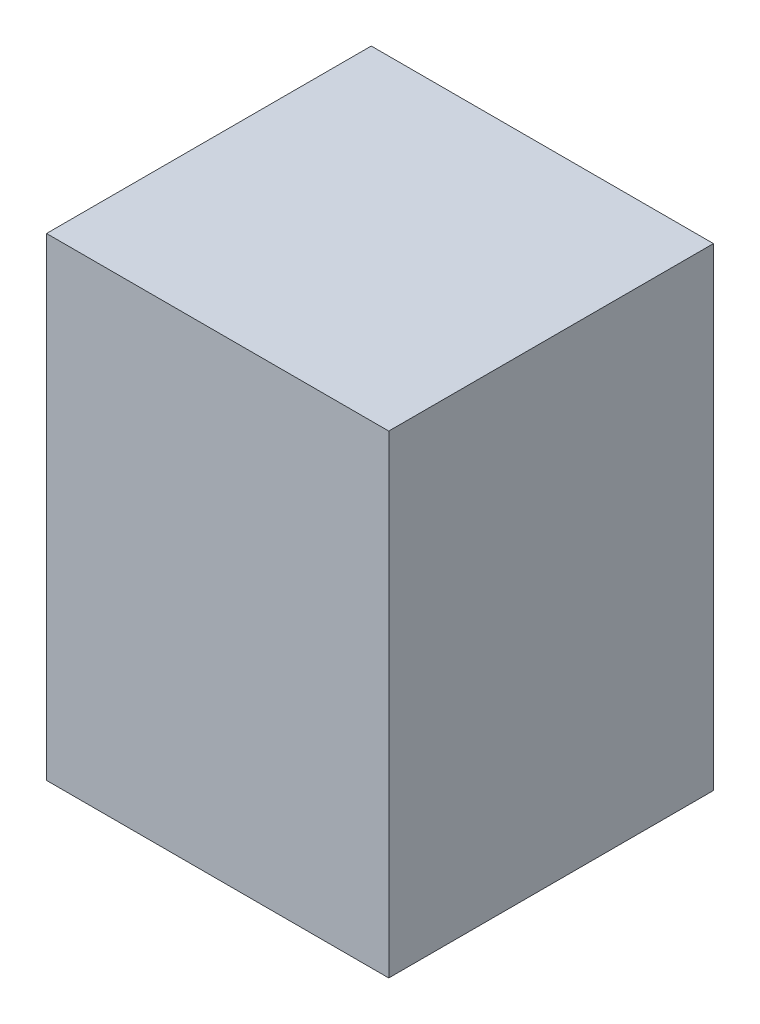
ISO-10303-21;
HEADER;
FILE_DESCRIPTION(('STEP AP214'),'2;1');
FILE_NAME('part.step','',(''),(''),'','','');
FILE_SCHEMA(('AUTOMOTIVE_DESIGN { 1 0 10303 214 1 1 1 1 }'));
ENDSEC;
DATA;
#1=APPLICATION_CONTEXT('core data for automotive mechanical design processes');
#2=APPLICATION_PROTOCOL_DEFINITION('international standard','automotive_design',2000,#1);
#3=PRODUCT_CONTEXT('',#1,'mechanical');
#4=PRODUCT('Part','Part','',(#3));
#5=PRODUCT_RELATED_PRODUCT_CATEGORY('part','',(#4));
#6=PRODUCT_DEFINITION_FORMATION('','',#4);
#7=PRODUCT_DEFINITION_CONTEXT('part definition',#1,'design');
#8=PRODUCT_DEFINITION('design','',#6,#7);
#9=PRODUCT_DEFINITION_SHAPE('','',#8);
#10=(LENGTH_UNIT() NAMED_UNIT(*) SI_UNIT(.MILLI.,.METRE.));
#11=(NAMED_UNIT(*) PLANE_ANGLE_UNIT() SI_UNIT($,.RADIAN.));
#12=(NAMED_UNIT(*) SI_UNIT($,.STERADIAN.) SOLID_ANGLE_UNIT());
#13=UNCERTAINTY_MEASURE_WITH_UNIT(LENGTH_MEASURE(1.E-05),#10,'distance_accuracy_value','');
#14=(GEOMETRIC_REPRESENTATION_CONTEXT(3) GLOBAL_UNCERTAINTY_ASSIGNED_CONTEXT((#13)) GLOBAL_UNIT_ASSIGNED_CONTEXT((#10,
#11,#12)) REPRESENTATION_CONTEXT('',''));
#15=CARTESIAN_POINT('',(0.,0.,0.));
#16=DIRECTION('',(0.,0.,1.));
#17=DIRECTION('',(1.,0.,0.));
#18=AXIS2_PLACEMENT_3D('',#15,#16,#17);
#19=CARTESIAN_POINT('',(-39.3425931169986,127.,38.5050482733504));
#20=DIRECTION('',(1.,0.,0.));
#21=DIRECTION('',(0.,0.,-1.));
#22=AXIS2_PLACEMENT_3D('',#19,#20,#21);
#23=PLANE('',#22);
#24=DIRECTION('',(0.,0.,1.));
#25=VECTOR('',#24,1.);
#26=CARTESIAN_POINT('',(-39.3425931169986,0.,38.5050482733504));
#27=LINE('',#26,#25);
#28=CARTESIAN_POINT('',(-39.3425931169986,0.,-48.5561907469787));
#29=VERTEX_POINT('',#28);
#30=CARTESIAN_POINT('',(-39.3425931169986,0.,38.5050482733504));
#31=VERTEX_POINT('',#30);
#32=EDGE_CURVE('E96',#29,#31,#27,.T.);
#33=ORIENTED_EDGE('',*,*,#32,.T.);
#34=DIRECTION('',(0.,-1.,0.));
#35=VECTOR('',#34,1.);
#36=CARTESIAN_POINT('',(-39.3425931169986,127.,38.5050482733504));
#37=LINE('',#36,#35);
#38=CARTESIAN_POINT('',(-39.3425931169986,127.,38.5050482733504));
#39=VERTEX_POINT('',#38);
#40=EDGE_CURVE('E11',#39,#31,#37,.T.);
#41=ORIENTED_EDGE('',*,*,#40,.F.);
#42=DIRECTION('',(0.,0.,1.));
#43=VECTOR('',#42,1.);
#44=CARTESIAN_POINT('',(-39.3425931169986,127.,38.5050482733504));
#45=LINE('',#44,#43);
#46=CARTESIAN_POINT('',(-39.3425931169986,127.,-48.5561907469787));
#47=VERTEX_POINT('',#46);
#48=EDGE_CURVE('E84',#47,#39,#45,.T.);
#49=ORIENTED_EDGE('',*,*,#48,.F.);
#50=DIRECTION('',(0.,-1.,0.));
#51=VECTOR('',#50,1.);
#52=CARTESIAN_POINT('',(-39.3425931169986,127.,-48.5561907469787));
#53=LINE('',#52,#51);
#54=EDGE_CURVE('E92',#47,#29,#53,.T.);
#55=ORIENTED_EDGE('',*,*,#54,.T.);
#56=EDGE_LOOP('',(#33,#41,#49,#55));
#57=FACE_BOUND('',#56,.T.);
#58=ADVANCED_FACE('F33',(#57),#23,.F.);
#59=CARTESIAN_POINT('',(-39.3425931169986,127.,38.5050482733504));
#60=DIRECTION('',(0.,0.,-1.));
#61=DIRECTION('',(-1.,0.,0.));
#62=AXIS2_PLACEMENT_3D('',#59,#60,#61);
#63=PLANE('',#62);
#64=DIRECTION('',(1.,0.,0.));
#65=VECTOR('',#64,1.);
#66=CARTESIAN_POINT('',(-39.3425931169986,0.,38.5050482733504));
#67=LINE('',#66,#65);
#68=CARTESIAN_POINT('',(52.4120324969317,0.,38.5050482733504));
#69=VERTEX_POINT('',#68);
#70=EDGE_CURVE('E88',#31,#69,#67,.T.);
#71=ORIENTED_EDGE('',*,*,#70,.T.);
#72=DIRECTION('',(0.,-1.,0.));
#73=VECTOR('',#72,1.);
#74=CARTESIAN_POINT('',(52.4120324969317,127.,38.5050482733504));
#75=LINE('',#74,#73);
#76=CARTESIAN_POINT('',(52.4120324969317,127.,38.5050482733504));
#77=VERTEX_POINT('',#76);
#78=EDGE_CURVE('E41',#77,#69,#75,.T.);
#79=ORIENTED_EDGE('',*,*,#78,.F.);
#80=DIRECTION('',(1.,0.,0.));
#81=VECTOR('',#80,1.);
#82=CARTESIAN_POINT('',(-39.3425931169986,127.,38.5050482733504));
#83=LINE('',#82,#81);
#84=EDGE_CURVE('E79',#39,#77,#83,.T.);
#85=ORIENTED_EDGE('',*,*,#84,.F.);
#86=ORIENTED_EDGE('',*,*,#40,.T.);
#87=EDGE_LOOP('',(#71,#79,#85,#86));
#88=FACE_BOUND('',#87,.T.);
#89=ADVANCED_FACE('F87',(#88),#63,.F.);
#90=CARTESIAN_POINT('',(52.4120324969317,127.,38.5050482733504));
#91=DIRECTION('',(-1.,0.,0.));
#92=DIRECTION('',(0.,0.,1.));
#93=AXIS2_PLACEMENT_3D('',#90,#91,#92);
#94=PLANE('',#93);
#95=DIRECTION('',(0.,0.,-1.));
#96=VECTOR('',#95,1.);
#97=CARTESIAN_POINT('',(52.4120324969317,0.,38.5050482733504));
#98=LINE('',#97,#96);
#99=CARTESIAN_POINT('',(52.4120324969317,0.,-48.5561907469787));
#100=VERTEX_POINT('',#99);
#101=EDGE_CURVE('E66',#69,#100,#98,.T.);
#102=ORIENTED_EDGE('',*,*,#101,.T.);
#103=DIRECTION('',(0.,-1.,0.));
#104=VECTOR('',#103,1.);
#105=CARTESIAN_POINT('',(52.4120324969317,127.,-48.5561907469787));
#106=LINE('',#105,#104);
#107=CARTESIAN_POINT('',(52.4120324969317,127.,-48.5561907469787));
#108=VERTEX_POINT('',#107);
#109=EDGE_CURVE('E89',#108,#100,#106,.T.);
#110=ORIENTED_EDGE('',*,*,#109,.F.);
#111=DIRECTION('',(0.,0.,-1.));
#112=VECTOR('',#111,1.);
#113=CARTESIAN_POINT('',(52.4120324969317,127.,38.5050482733504));
#114=LINE('',#113,#112);
#115=EDGE_CURVE('E82',#77,#108,#114,.T.);
#116=ORIENTED_EDGE('',*,*,#115,.F.);
#117=ORIENTED_EDGE('',*,*,#78,.T.);
#118=EDGE_LOOP('',(#102,#110,#116,#117));
#119=FACE_BOUND('',#118,.T.);
#120=ADVANCED_FACE('F90',(#119),#94,.F.);
#121=CARTESIAN_POINT('',(-39.3425931169986,127.,-48.5561907469787));
#122=DIRECTION('',(0.,0.,1.));
#123=DIRECTION('',(1.,0.,0.));
#124=AXIS2_PLACEMENT_3D('',#121,#122,#123);
#125=PLANE('',#124);
#126=DIRECTION('',(-1.,0.,0.));
#127=VECTOR('',#126,1.);
#128=CARTESIAN_POINT('',(-39.3425931169986,0.,-48.5561907469787));
#129=LINE('',#128,#127);
#130=EDGE_CURVE('E72',#100,#29,#129,.T.);
#131=ORIENTED_EDGE('',*,*,#130,.T.);
#132=ORIENTED_EDGE('',*,*,#54,.F.);
#133=DIRECTION('',(-1.,0.,0.));
#134=VECTOR('',#133,1.);
#135=CARTESIAN_POINT('',(-39.3425931169986,127.,-48.5561907469787));
#136=LINE('',#135,#134);
#137=EDGE_CURVE('E49',#108,#47,#136,.T.);
#138=ORIENTED_EDGE('',*,*,#137,.F.);
#139=ORIENTED_EDGE('',*,*,#109,.T.);
#140=EDGE_LOOP('',(#131,#132,#138,#139));
#141=FACE_BOUND('',#140,.T.);
#142=ADVANCED_FACE('F103',(#141),#125,.F.);
#143=CARTESIAN_POINT('',(0.,127.,0.));
#144=DIRECTION('',(0.,-1.,0.));
#145=DIRECTION('',(0.,0.,-1.));
#146=AXIS2_PLACEMENT_3D('',#143,#144,#145);
#147=PLANE('',#146);
#148=ORIENTED_EDGE('',*,*,#48,.T.);
#149=ORIENTED_EDGE('',*,*,#84,.T.);
#150=ORIENTED_EDGE('',*,*,#115,.T.);
#151=ORIENTED_EDGE('',*,*,#137,.T.);
#152=EDGE_LOOP('',(#148,#149,#150,#151));
#153=FACE_BOUND('',#152,.T.);
#154=ADVANCED_FACE('F80',(#153),#147,.F.);
#155=CARTESIAN_POINT('',(0.,0.,0.));
#156=DIRECTION('',(0.,-1.,0.));
#157=DIRECTION('',(0.,0.,-1.));
#158=AXIS2_PLACEMENT_3D('',#155,#156,#157);
#159=PLANE('',#158);
#160=ORIENTED_EDGE('',*,*,#32,.F.);
#161=ORIENTED_EDGE('',*,*,#130,.F.);
#162=ORIENTED_EDGE('',*,*,#101,.F.);
#163=ORIENTED_EDGE('',*,*,#70,.F.);
#164=EDGE_LOOP('',(#160,#161,#162,#163));
#165=FACE_BOUND('',#164,.T.);
#166=ADVANCED_FACE('F106',(#165),#159,.T.);
#167=CLOSED_SHELL('',(#58,#89,#120,#142,#154,#166));
#168=MANIFOLD_SOLID_BREP('B2',#167);
#169=ADVANCED_BREP_SHAPE_REPRESENTATION('',(#18,#168),#14);
#170=SHAPE_DEFINITION_REPRESENTATION(#9,#169);
ENDSEC;
END-ISO-10303-21;
